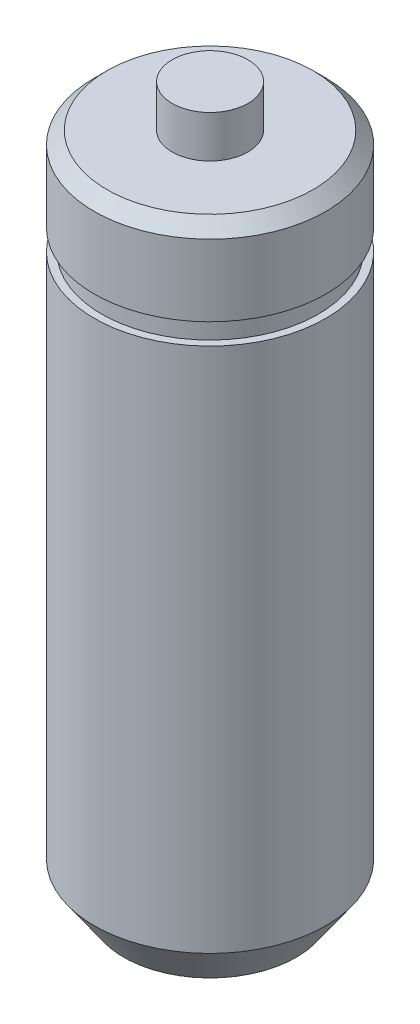
ISO-10303-21;
HEADER;
FILE_DESCRIPTION(('STEP AP214'),'2;1');
FILE_NAME('part.step','',(''),(''),'','','');
FILE_SCHEMA(('AUTOMOTIVE_DESIGN { 1 0 10303 214 1 1 1 1 }'));
ENDSEC;
DATA;
#1=APPLICATION_CONTEXT('core data for automotive mechanical design processes');
#2=APPLICATION_PROTOCOL_DEFINITION('international standard','automotive_design',2000,#1);
#3=PRODUCT_CONTEXT('',#1,'mechanical');
#4=PRODUCT('Part','Part','',(#3));
#5=PRODUCT_RELATED_PRODUCT_CATEGORY('part','',(#4));
#6=PRODUCT_DEFINITION_FORMATION('','',#4);
#7=PRODUCT_DEFINITION_CONTEXT('part definition',#1,'design');
#8=PRODUCT_DEFINITION('design','',#6,#7);
#9=PRODUCT_DEFINITION_SHAPE('','',#8);
#10=(LENGTH_UNIT() NAMED_UNIT(*) SI_UNIT(.MILLI.,.METRE.));
#11=(NAMED_UNIT(*) PLANE_ANGLE_UNIT() SI_UNIT($,.RADIAN.));
#12=(NAMED_UNIT(*) SI_UNIT($,.STERADIAN.) SOLID_ANGLE_UNIT());
#13=UNCERTAINTY_MEASURE_WITH_UNIT(LENGTH_MEASURE(1.E-05),#10,'distance_accuracy_value','');
#14=(GEOMETRIC_REPRESENTATION_CONTEXT(3) GLOBAL_UNCERTAINTY_ASSIGNED_CONTEXT((#13)) GLOBAL_UNIT_ASSIGNED_CONTEXT((#10,
#11,#12)) REPRESENTATION_CONTEXT('',''));
#15=CARTESIAN_POINT('',(0.,0.,0.));
#16=DIRECTION('',(0.,0.,1.));
#17=DIRECTION('',(1.,0.,0.));
#18=AXIS2_PLACEMENT_3D('',#15,#16,#17);
#19=CARTESIAN_POINT('',(0.,2.,0.));
#20=DIRECTION('',(0.,1.,0.));
#21=DIRECTION('',(0.,0.,1.));
#22=AXIS2_PLACEMENT_3D('',#19,#20,#21);
#23=PLANE('',#22);
#24=CARTESIAN_POINT('',(0.,2.,0.));
#25=DIRECTION('',(0.,-1.,0.));
#26=DIRECTION('',(0.,0.,-1.));
#27=AXIS2_PLACEMENT_3D('',#24,#25,#26);
#28=CIRCLE('',#27,1.8);
#29=CARTESIAN_POINT('',(0.,2.,-1.8));
#30=VERTEX_POINT('',#29);
#31=EDGE_CURVE('E10',#30,#30,#28,.T.);
#32=ORIENTED_EDGE('',*,*,#31,.F.);
#33=EDGE_LOOP('',(#32));
#34=FACE_BOUND('',#33,.T.);
#35=ADVANCED_FACE('F31',(#34),#23,.T.);
#36=CARTESIAN_POINT('',(0.,-36.,0.));
#37=DIRECTION('',(0.,-1.,0.));
#38=DIRECTION('',(0.,0.,-1.));
#39=AXIS2_PLACEMENT_3D('',#36,#37,#38);
#40=CYLINDRICAL_SURFACE('',#39,1.8);
#41=ORIENTED_EDGE('',*,*,#31,.T.);
#42=EDGE_LOOP('',(#41));
#43=FACE_BOUND('',#42,.T.);
#44=CARTESIAN_POINT('',(0.,0.,0.));
#45=DIRECTION('',(0.,-1.,0.));
#46=DIRECTION('',(0.,0.,-1.));
#47=AXIS2_PLACEMENT_3D('',#44,#45,#46);
#48=CIRCLE('',#47,1.8);
#49=CARTESIAN_POINT('',(0.,0.,-1.8));
#50=VERTEX_POINT('',#49);
#51=EDGE_CURVE('E37',#50,#50,#48,.T.);
#52=ORIENTED_EDGE('',*,*,#51,.F.);
#53=EDGE_LOOP('',(#52));
#54=FACE_BOUND('',#53,.T.);
#55=ADVANCED_FACE('F85',(#43,#54),#40,.T.);
#56=CARTESIAN_POINT('',(1.8,0.,0.));
#57=DIRECTION('',(0.,1.,0.));
#58=DIRECTION('',(0.,0.,1.));
#59=AXIS2_PLACEMENT_3D('',#56,#57,#58);
#60=PLANE('',#59);
#61=ORIENTED_EDGE('',*,*,#51,.T.);
#62=EDGE_LOOP('',(#61));
#63=FACE_BOUND('',#62,.T.);
#64=CARTESIAN_POINT('',(0.,0.,0.));
#65=DIRECTION('',(0.,-1.,0.));
#66=DIRECTION('',(0.,0.,-1.));
#67=AXIS2_PLACEMENT_3D('',#64,#65,#66);
#68=CIRCLE('',#67,4.9);
#69=CARTESIAN_POINT('',(0.,0.,-4.9));
#70=VERTEX_POINT('',#69);
#71=EDGE_CURVE('E41',#70,#70,#68,.T.);
#72=ORIENTED_EDGE('',*,*,#71,.F.);
#73=EDGE_LOOP('',(#72));
#74=FACE_BOUND('',#73,.T.);
#75=ADVANCED_FACE('F90',(#63,#74),#60,.T.);
#76=CARTESIAN_POINT('',(0.,-0.600000000000003,0.));
#77=DIRECTION('',(0.,-1.,0.));
#78=DIRECTION('',(0.,0.,-1.));
#79=AXIS2_PLACEMENT_3D('',#76,#77,#78);
#80=CONICAL_SURFACE('',#79,5.5,0.785398163397445);
#81=ORIENTED_EDGE('',*,*,#71,.T.);
#82=EDGE_LOOP('',(#81));
#83=FACE_BOUND('',#82,.T.);
#84=CARTESIAN_POINT('',(0.,-0.600000000000003,0.));
#85=DIRECTION('',(0.,-1.,0.));
#86=DIRECTION('',(0.,0.,-1.));
#87=AXIS2_PLACEMENT_3D('',#84,#85,#86);
#88=CIRCLE('',#87,5.5);
#89=CARTESIAN_POINT('',(0.,-0.600000000000003,-5.5));
#90=VERTEX_POINT('',#89);
#91=EDGE_CURVE('E45',#90,#90,#88,.T.);
#92=ORIENTED_EDGE('',*,*,#91,.F.);
#93=EDGE_LOOP('',(#92));
#94=FACE_BOUND('',#93,.T.);
#95=ADVANCED_FACE('F94',(#83,#94),#80,.T.);
#96=CARTESIAN_POINT('',(0.,-36.,0.));
#97=DIRECTION('',(0.,-1.,0.));
#98=DIRECTION('',(0.,0.,-1.));
#99=AXIS2_PLACEMENT_3D('',#96,#97,#98);
#100=CYLINDRICAL_SURFACE('',#99,5.5);
#101=ORIENTED_EDGE('',*,*,#91,.T.);
#102=EDGE_LOOP('',(#101));
#103=FACE_BOUND('',#102,.T.);
#104=CARTESIAN_POINT('',(0.,-4.,0.));
#105=DIRECTION('',(0.,-1.,0.));
#106=DIRECTION('',(0.,0.,-1.));
#107=AXIS2_PLACEMENT_3D('',#104,#105,#106);
#108=CIRCLE('',#107,5.5);
#109=CARTESIAN_POINT('',(0.,-4.,-5.5));
#110=VERTEX_POINT('',#109);
#111=EDGE_CURVE('E50',#110,#110,#108,.T.);
#112=ORIENTED_EDGE('',*,*,#111,.F.);
#113=EDGE_LOOP('',(#112));
#114=FACE_BOUND('',#113,.T.);
#115=ADVANCED_FACE('F100',(#103,#114),#100,.T.);
#116=CARTESIAN_POINT('',(5.5,-4.,0.));
#117=DIRECTION('',(0.,-1.,0.));
#118=DIRECTION('',(0.,0.,-1.));
#119=AXIS2_PLACEMENT_3D('',#116,#117,#118);
#120=PLANE('',#119);
#121=ORIENTED_EDGE('',*,*,#111,.T.);
#122=EDGE_LOOP('',(#121));
#123=FACE_BOUND('',#122,.T.);
#124=CARTESIAN_POINT('',(0.,-4.,0.));
#125=DIRECTION('',(0.,-1.,0.));
#126=DIRECTION('',(0.,0.,-1.));
#127=AXIS2_PLACEMENT_3D('',#124,#125,#126);
#128=CIRCLE('',#127,5.15);
#129=CARTESIAN_POINT('',(0.,-4.,-5.15));
#130=VERTEX_POINT('',#129);
#131=EDGE_CURVE('E53',#130,#130,#128,.T.);
#132=ORIENTED_EDGE('',*,*,#131,.F.);
#133=EDGE_LOOP('',(#132));
#134=FACE_BOUND('',#133,.T.);
#135=ADVANCED_FACE('F104',(#123,#134),#120,.T.);
#136=CARTESIAN_POINT('',(0.,-36.,0.));
#137=DIRECTION('',(0.,-1.,0.));
#138=DIRECTION('',(0.,0.,-1.));
#139=AXIS2_PLACEMENT_3D('',#136,#137,#138);
#140=CYLINDRICAL_SURFACE('',#139,5.15);
#141=ORIENTED_EDGE('',*,*,#131,.T.);
#142=EDGE_LOOP('',(#141));
#143=FACE_BOUND('',#142,.T.);
#144=CARTESIAN_POINT('',(0.,-5.,0.));
#145=DIRECTION('',(0.,-1.,0.));
#146=DIRECTION('',(0.,0.,-1.));
#147=AXIS2_PLACEMENT_3D('',#144,#145,#146);
#148=CIRCLE('',#147,5.15);
#149=CARTESIAN_POINT('',(0.,-5.,-5.15));
#150=VERTEX_POINT('',#149);
#151=EDGE_CURVE('E56',#150,#150,#148,.T.);
#152=ORIENTED_EDGE('',*,*,#151,.F.);
#153=EDGE_LOOP('',(#152));
#154=FACE_BOUND('',#153,.T.);
#155=ADVANCED_FACE('F108',(#143,#154),#140,.T.);
#156=CARTESIAN_POINT('',(5.15,-5.,0.));
#157=DIRECTION('',(0.,1.,0.));
#158=DIRECTION('',(0.,0.,1.));
#159=AXIS2_PLACEMENT_3D('',#156,#157,#158);
#160=PLANE('',#159);
#161=ORIENTED_EDGE('',*,*,#151,.T.);
#162=EDGE_LOOP('',(#161));
#163=FACE_BOUND('',#162,.T.);
#164=CARTESIAN_POINT('',(0.,-5.,0.));
#165=DIRECTION('',(0.,-1.,0.));
#166=DIRECTION('',(0.,0.,-1.));
#167=AXIS2_PLACEMENT_3D('',#164,#165,#166);
#168=CIRCLE('',#167,5.5);
#169=CARTESIAN_POINT('',(0.,-5.,-5.5));
#170=VERTEX_POINT('',#169);
#171=EDGE_CURVE('E59',#170,#170,#168,.T.);
#172=ORIENTED_EDGE('',*,*,#171,.F.);
#173=EDGE_LOOP('',(#172));
#174=FACE_BOUND('',#173,.T.);
#175=ADVANCED_FACE('F81',(#163,#174),#160,.T.);
#176=CARTESIAN_POINT('',(0.,-36.,0.));
#177=DIRECTION('',(0.,-1.,0.));
#178=DIRECTION('',(0.,0.,-1.));
#179=AXIS2_PLACEMENT_3D('',#176,#177,#178);
#180=CYLINDRICAL_SURFACE('',#179,5.5);
#181=ORIENTED_EDGE('',*,*,#171,.T.);
#182=EDGE_LOOP('',(#181));
#183=FACE_BOUND('',#182,.T.);
#184=CARTESIAN_POINT('',(0.,-30.,0.));
#185=DIRECTION('',(0.,-1.,0.));
#186=DIRECTION('',(0.,0.,-1.));
#187=AXIS2_PLACEMENT_3D('',#184,#185,#186);
#188=CIRCLE('',#187,5.5);
#189=CARTESIAN_POINT('',(0.,-30.,-5.5));
#190=VERTEX_POINT('',#189);
#191=EDGE_CURVE('E62',#190,#190,#188,.T.);
#192=ORIENTED_EDGE('',*,*,#191,.F.);
#193=EDGE_LOOP('',(#192));
#194=FACE_BOUND('',#193,.T.);
#195=ADVANCED_FACE('F73',(#183,#194),#180,.T.);
#196=CARTESIAN_POINT('',(0.,-32.,0.));
#197=DIRECTION('',(0.,1.,0.));
#198=DIRECTION('',(0.,0.,1.));
#199=AXIS2_PLACEMENT_3D('',#196,#197,#198);
#200=CONICAL_SURFACE('',#199,4.1,0.610725964389208);
#201=ORIENTED_EDGE('',*,*,#191,.T.);
#202=EDGE_LOOP('',(#201));
#203=FACE_BOUND('',#202,.T.);
#204=CARTESIAN_POINT('',(0.,-32.,0.));
#205=DIRECTION('',(0.,-1.,0.));
#206=DIRECTION('',(0.,0.,-1.));
#207=AXIS2_PLACEMENT_3D('',#204,#205,#206);
#208=CIRCLE('',#207,4.1);
#209=CARTESIAN_POINT('',(0.,-32.,-4.1));
#210=VERTEX_POINT('',#209);
#211=EDGE_CURVE('E65',#210,#210,#208,.T.);
#212=ORIENTED_EDGE('',*,*,#211,.F.);
#213=EDGE_LOOP('',(#212));
#214=FACE_BOUND('',#213,.T.);
#215=ADVANCED_FACE('F71',(#203,#214),#200,.T.);
#216=CARTESIAN_POINT('',(4.1,-32.,0.));
#217=DIRECTION('',(0.,-1.,0.));
#218=DIRECTION('',(0.,0.,-1.));
#219=AXIS2_PLACEMENT_3D('',#216,#217,#218);
#220=PLANE('',#219);
#221=ORIENTED_EDGE('',*,*,#211,.T.);
#222=EDGE_LOOP('',(#221));
#223=FACE_BOUND('',#222,.T.);
#224=ADVANCED_FACE('F69',(#223),#220,.T.);
#225=CLOSED_SHELL('',(#35,#55,#75,#95,#115,#135,#155,#175,#195,#215,#224));
#226=MANIFOLD_SOLID_BREP('B2',#225);
#227=ADVANCED_BREP_SHAPE_REPRESENTATION('',(#18,#226),#14);
#228=SHAPE_DEFINITION_REPRESENTATION(#9,#227);
ENDSEC;
END-ISO-10303-21;
